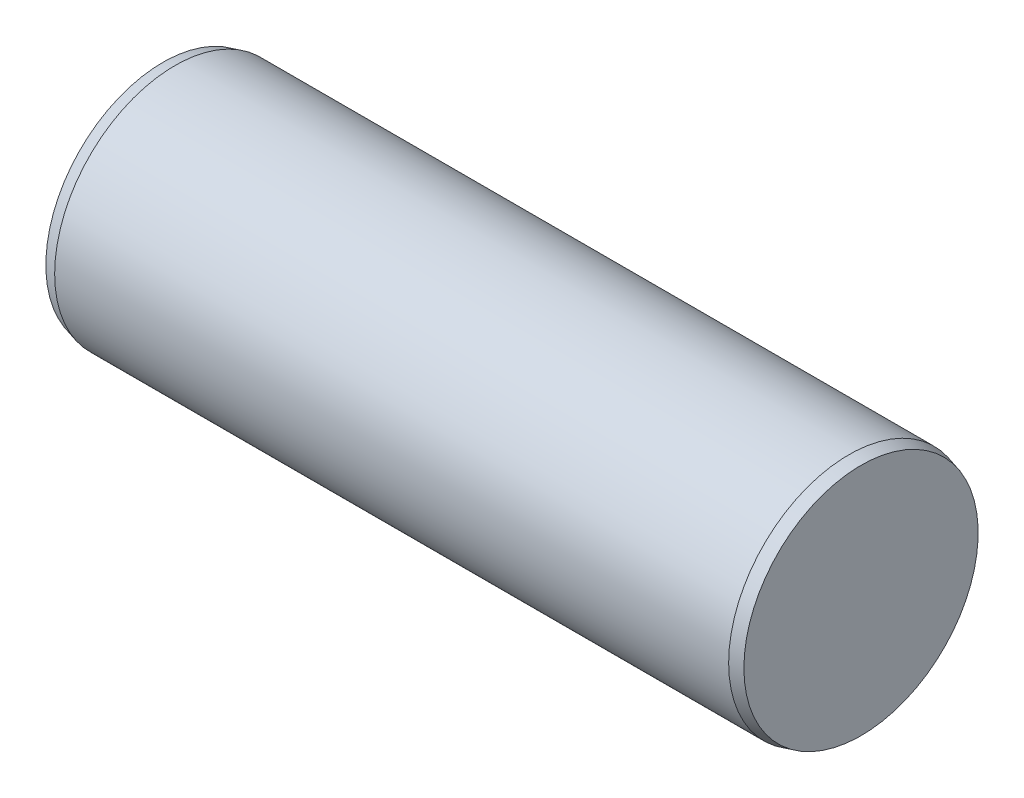
ISO-10303-21;
HEADER;
FILE_DESCRIPTION(('STEP AP214'),'2;1');
FILE_NAME('part.step','',(''),(''),'','','');
FILE_SCHEMA(('AUTOMOTIVE_DESIGN { 1 0 10303 214 1 1 1 1 }'));
ENDSEC;
DATA;
#1=APPLICATION_CONTEXT('core data for automotive mechanical design processes');
#2=APPLICATION_PROTOCOL_DEFINITION('international standard','automotive_design',2000,#1);
#3=PRODUCT_CONTEXT('',#1,'mechanical');
#4=PRODUCT('Part','Part','',(#3));
#5=PRODUCT_RELATED_PRODUCT_CATEGORY('part','',(#4));
#6=PRODUCT_DEFINITION_FORMATION('','',#4);
#7=PRODUCT_DEFINITION_CONTEXT('part definition',#1,'design');
#8=PRODUCT_DEFINITION('design','',#6,#7);
#9=PRODUCT_DEFINITION_SHAPE('','',#8);
#10=(LENGTH_UNIT() NAMED_UNIT(*) SI_UNIT(.MILLI.,.METRE.));
#11=(NAMED_UNIT(*) PLANE_ANGLE_UNIT() SI_UNIT($,.RADIAN.));
#12=(NAMED_UNIT(*) SI_UNIT($,.STERADIAN.) SOLID_ANGLE_UNIT());
#13=UNCERTAINTY_MEASURE_WITH_UNIT(LENGTH_MEASURE(1.E-05),#10,'distance_accuracy_value','');
#14=(GEOMETRIC_REPRESENTATION_CONTEXT(3) GLOBAL_UNCERTAINTY_ASSIGNED_CONTEXT((#13)) GLOBAL_UNIT_ASSIGNED_CONTEXT((#10,
#11,#12)) REPRESENTATION_CONTEXT('',''));
#15=CARTESIAN_POINT('',(0.,0.,0.));
#16=DIRECTION('',(0.,0.,1.));
#17=DIRECTION('',(1.,0.,0.));
#18=AXIS2_PLACEMENT_3D('',#15,#16,#17);
#19=CARTESIAN_POINT('',(7.25,-2.462208854,2.462208854));
#20=DIRECTION('',(1.,0.,0.));
#21=DIRECTION('',(0.,0.,-1.));
#22=AXIS2_PLACEMENT_3D('',#19,#20,#21);
#23=PLANE('',#22);
#24=CARTESIAN_POINT('',(7.24999999999998,0.,0.));
#25=DIRECTION('',(-1.,0.,0.));
#26=DIRECTION('',(0.,0.,1.));
#27=AXIS2_PLACEMENT_3D('',#24,#25,#26);
#28=CIRCLE('',#27,2.43301270200001);
#29=CARTESIAN_POINT('',(7.24999999999998,0.,2.43301270200001));
#30=VERTEX_POINT('',#29);
#31=EDGE_CURVE('E18',#30,#30,#28,.F.);
#32=ORIENTED_EDGE('',*,*,#31,.T.);
#33=EDGE_LOOP('',(#32));
#34=FACE_BOUND('',#33,.T.);
#35=ADVANCED_FACE('F14',(#34),#23,.T.);
#36=CARTESIAN_POINT('',(7.25,0.,0.));
#37=DIRECTION('',(-1.,0.,0.));
#38=DIRECTION('',(0.,0.,1.));
#39=AXIS2_PLACEMENT_3D('',#36,#37,#38);
#40=CONICAL_SURFACE('',#39,2.433012702,0.261799387396906);
#41=CARTESIAN_POINT('',(7.,0.,0.));
#42=DIRECTION('',(1.,0.,0.));
#43=DIRECTION('',(0.,0.,-1.));
#44=AXIS2_PLACEMENT_3D('',#41,#42,#43);
#45=CIRCLE('',#44,2.5);
#46=CARTESIAN_POINT('',(7.,0.,-2.5));
#47=VERTEX_POINT('',#46);
#48=EDGE_CURVE('E26',#47,#47,#45,.T.);
#49=ORIENTED_EDGE('',*,*,#48,.T.);
#50=EDGE_LOOP('',(#49));
#51=FACE_BOUND('',#50,.T.);
#52=ORIENTED_EDGE('',*,*,#31,.F.);
#53=EDGE_LOOP('',(#52));
#54=FACE_BOUND('',#53,.T.);
#55=ADVANCED_FACE('F36',(#51,#54),#40,.T.);
#56=CARTESIAN_POINT('',(-7.,0.,0.));
#57=DIRECTION('',(1.,0.,0.));
#58=DIRECTION('',(0.,1.,0.));
#59=AXIS2_PLACEMENT_3D('',#56,#57,#58);
#60=CYLINDRICAL_SURFACE('',#59,2.5);
#61=CARTESIAN_POINT('',(-6.9999999999999,0.,0.));
#62=DIRECTION('',(1.,0.,0.));
#63=DIRECTION('',(0.,0.,1.));
#64=AXIS2_PLACEMENT_3D('',#61,#62,#63);
#65=CIRCLE('',#64,2.5);
#66=CARTESIAN_POINT('',(-7.,0.,2.5));
#67=VERTEX_POINT('',#66);
#68=EDGE_CURVE('E22',#67,#67,#65,.T.);
#69=ORIENTED_EDGE('',*,*,#68,.T.);
#70=EDGE_LOOP('',(#69));
#71=FACE_BOUND('',#70,.T.);
#72=ORIENTED_EDGE('',*,*,#48,.F.);
#73=EDGE_LOOP('',(#72));
#74=FACE_BOUND('',#73,.T.);
#75=ADVANCED_FACE('F38',(#71,#74),#60,.T.);
#76=CARTESIAN_POINT('',(-7.25,-2.462208854,-2.462208854));
#77=DIRECTION('',(-1.,0.,0.));
#78=DIRECTION('',(0.,0.,1.));
#79=AXIS2_PLACEMENT_3D('',#76,#77,#78);
#80=PLANE('',#79);
#81=CARTESIAN_POINT('',(-7.24999999999998,0.,0.));
#82=DIRECTION('',(1.,0.,0.));
#83=DIRECTION('',(0.,0.,-1.));
#84=AXIS2_PLACEMENT_3D('',#81,#82,#83);
#85=CIRCLE('',#84,2.43301270200001);
#86=CARTESIAN_POINT('',(-7.24999999999998,0.,-2.43301270200001));
#87=VERTEX_POINT('',#86);
#88=EDGE_CURVE('E9',#87,#87,#85,.F.);
#89=ORIENTED_EDGE('',*,*,#88,.T.);
#90=EDGE_LOOP('',(#89));
#91=FACE_BOUND('',#90,.T.);
#92=ADVANCED_FACE('F16',(#91),#80,.T.);
#93=CARTESIAN_POINT('',(-7.25,0.,0.));
#94=DIRECTION('',(1.,0.,0.));
#95=DIRECTION('',(0.,0.,-1.));
#96=AXIS2_PLACEMENT_3D('',#93,#94,#95);
#97=CONICAL_SURFACE('',#96,2.433012702,0.261799387396906);
#98=ORIENTED_EDGE('',*,*,#88,.F.);
#99=EDGE_LOOP('',(#98));
#100=FACE_BOUND('',#99,.T.);
#101=ORIENTED_EDGE('',*,*,#68,.F.);
#102=EDGE_LOOP('',(#101));
#103=FACE_BOUND('',#102,.T.);
#104=ADVANCED_FACE('F47',(#100,#103),#97,.T.);
#105=CLOSED_SHELL('',(#35,#55,#75,#92,#104));
#106=MANIFOLD_SOLID_BREP('B1',#105);
#107=ADVANCED_BREP_SHAPE_REPRESENTATION('',(#18,#106),#14);
#108=SHAPE_DEFINITION_REPRESENTATION(#9,#107);
ENDSEC;
END-ISO-10303-21;
